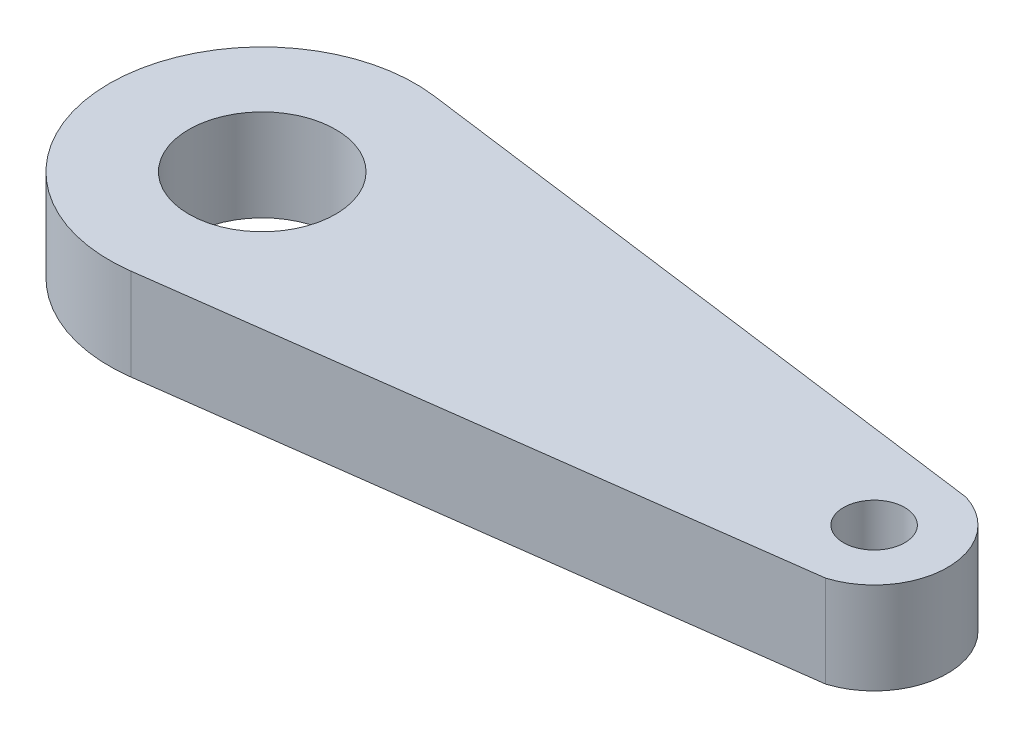
ISO-10303-21;
HEADER;
FILE_DESCRIPTION(('STEP AP214'),'2;1');
FILE_NAME('part.step','',(''),(''),'','','');
FILE_SCHEMA(('AUTOMOTIVE_DESIGN { 1 0 10303 214 1 1 1 1 }'));
ENDSEC;
DATA;
#1=APPLICATION_CONTEXT('core data for automotive mechanical design processes');
#2=APPLICATION_PROTOCOL_DEFINITION('international standard','automotive_design',2000,#1);
#3=PRODUCT_CONTEXT('',#1,'mechanical');
#4=PRODUCT('Part','Part','',(#3));
#5=PRODUCT_RELATED_PRODUCT_CATEGORY('part','',(#4));
#6=PRODUCT_DEFINITION_FORMATION('','',#4);
#7=PRODUCT_DEFINITION_CONTEXT('part definition',#1,'design');
#8=PRODUCT_DEFINITION('design','',#6,#7);
#9=PRODUCT_DEFINITION_SHAPE('','',#8);
#10=(LENGTH_UNIT() NAMED_UNIT(*) SI_UNIT(.MILLI.,.METRE.));
#11=(NAMED_UNIT(*) PLANE_ANGLE_UNIT() SI_UNIT($,.RADIAN.));
#12=(NAMED_UNIT(*) SI_UNIT($,.STERADIAN.) SOLID_ANGLE_UNIT());
#13=UNCERTAINTY_MEASURE_WITH_UNIT(LENGTH_MEASURE(1.E-05),#10,'distance_accuracy_value','');
#14=(GEOMETRIC_REPRESENTATION_CONTEXT(3) GLOBAL_UNCERTAINTY_ASSIGNED_CONTEXT((#13)) GLOBAL_UNIT_ASSIGNED_CONTEXT((#10,
#11,#12)) REPRESENTATION_CONTEXT('',''));
#15=CARTESIAN_POINT('',(0.,0.,0.));
#16=DIRECTION('',(0.,0.,1.));
#17=DIRECTION('',(1.,0.,0.));
#18=AXIS2_PLACEMENT_3D('',#15,#16,#17);
#19=CARTESIAN_POINT('',(31.2759201015185,190.5,235.46813409764));
#20=DIRECTION('',(-0.131668040112529,0.,-0.991293865215016));
#21=DIRECTION('',(-0.991293865215016,0.,0.131668040112529));
#22=AXIS2_PLACEMENT_3D('',#19,#20,#21);
#23=PLANE('',#22);
#24=DIRECTION('',(0.991293865215016,0.,-0.131668040112529));
#25=VECTOR('',#24,1.);
#26=CARTESIAN_POINT('',(31.2759201015185,0.,235.46813409764));
#27=LINE('',#26,#25);
#28=CARTESIAN_POINT('',(-565.509397264272,0.,314.735802205768));
#29=VERTEX_POINT('',#28);
#30=CARTESIAN_POINT('',(707.574831550017,0.,145.639118378526));
#31=VERTEX_POINT('',#30);
#32=EDGE_CURVE('E114',#29,#31,#27,.T.);
#33=ORIENTED_EDGE('',*,*,#32,.T.);
#34=DIRECTION('',(0.,-1.,0.));
#35=VECTOR('',#34,1.);
#36=CARTESIAN_POINT('',(707.574831550017,190.5,145.639118378526));
#37=LINE('',#36,#35);
#38=CARTESIAN_POINT('',(707.574831550017,190.5,145.639118378526));
#39=VERTEX_POINT('',#38);
#40=EDGE_CURVE('E11',#39,#31,#37,.T.);
#41=ORIENTED_EDGE('',*,*,#40,.F.);
#42=DIRECTION('',(0.991293865215016,0.,-0.131668040112529));
#43=VECTOR('',#42,1.);
#44=CARTESIAN_POINT('',(31.2759201015185,190.5,235.46813409764));
#45=LINE('',#44,#43);
#46=CARTESIAN_POINT('',(-565.509397264272,190.5,314.735802205768));
#47=VERTEX_POINT('',#46);
#48=EDGE_CURVE('E93',#47,#39,#45,.T.);
#49=ORIENTED_EDGE('',*,*,#48,.F.);
#50=DIRECTION('',(0.,-1.,0.));
#51=VECTOR('',#50,1.);
#52=CARTESIAN_POINT('',(-565.509397264272,190.5,314.735802205768));
#53=LINE('',#52,#51);
#54=EDGE_CURVE('E101',#47,#29,#53,.T.);
#55=ORIENTED_EDGE('',*,*,#54,.T.);
#56=EDGE_LOOP('',(#33,#41,#49,#55));
#57=FACE_BOUND('',#56,.T.);
#58=ADVANCED_FACE('F44',(#57),#23,.F.);
#59=CARTESIAN_POINT('',(662.686,190.5,0.));
#60=DIRECTION('',(0.,-1.,0.));
#61=DIRECTION('',(0.,0.,-1.));
#62=AXIS2_PLACEMENT_3D('',#59,#60,#61);
#63=CYLINDRICAL_SURFACE('',#62,152.4);
#64=CARTESIAN_POINT('',(662.686,0.,0.));
#65=DIRECTION('',(0.,1.,0.));
#66=DIRECTION('',(0.,0.,1.));
#67=AXIS2_PLACEMENT_3D('',#64,#65,#66);
#68=CIRCLE('',#67,152.4);
#69=CARTESIAN_POINT('',(707.574831550017,0.,-145.639118378526));
#70=VERTEX_POINT('',#69);
#71=EDGE_CURVE('E97',#31,#70,#68,.T.);
#72=ORIENTED_EDGE('',*,*,#71,.T.);
#73=DIRECTION('',(0.,-1.,0.));
#74=VECTOR('',#73,1.);
#75=CARTESIAN_POINT('',(707.574831550017,190.5,-145.639118378526));
#76=LINE('',#75,#74);
#77=CARTESIAN_POINT('',(707.574831550017,190.5,-145.639118378526));
#78=VERTEX_POINT('',#77);
#79=EDGE_CURVE('E53',#78,#70,#76,.T.);
#80=ORIENTED_EDGE('',*,*,#79,.F.);
#81=CARTESIAN_POINT('',(662.686,190.5,0.));
#82=DIRECTION('',(0.,1.,0.));
#83=DIRECTION('',(0.,0.,1.));
#84=AXIS2_PLACEMENT_3D('',#81,#82,#83);
#85=CIRCLE('',#84,152.4);
#86=EDGE_CURVE('E88',#39,#78,#85,.T.);
#87=ORIENTED_EDGE('',*,*,#86,.F.);
#88=ORIENTED_EDGE('',*,*,#40,.T.);
#89=EDGE_LOOP('',(#72,#80,#87,#88));
#90=FACE_BOUND('',#89,.T.);
#91=ADVANCED_FACE('F100',(#90),#63,.T.);
#92=CARTESIAN_POINT('',(31.2759201015185,190.5,-235.46813409764));
#93=DIRECTION('',(0.131668040112529,0.,-0.991293865215016));
#94=DIRECTION('',(-0.991293865215016,0.,-0.131668040112529));
#95=AXIS2_PLACEMENT_3D('',#92,#93,#94);
#96=PLANE('',#95);
#97=DIRECTION('',(0.991293865215016,0.,0.131668040112529));
#98=VECTOR('',#97,1.);
#99=CARTESIAN_POINT('',(31.2759201015185,0.,-235.46813409764));
#100=LINE('',#99,#98);
#101=CARTESIAN_POINT('',(-565.509397264272,0.,-314.735802205768));
#102=VERTEX_POINT('',#101);
#103=EDGE_CURVE('E119',#102,#70,#100,.T.);
#104=ORIENTED_EDGE('',*,*,#103,.F.);
#105=DIRECTION('',(0.,-1.,0.));
#106=VECTOR('',#105,1.);
#107=CARTESIAN_POINT('',(-565.509397264272,190.5,-314.735802205768));
#108=LINE('',#107,#106);
#109=CARTESIAN_POINT('',(-565.509397264272,190.5,-314.735802205768));
#110=VERTEX_POINT('',#109);
#111=EDGE_CURVE('E76',#110,#102,#108,.T.);
#112=ORIENTED_EDGE('',*,*,#111,.F.);
#113=DIRECTION('',(0.991293865215016,0.,0.131668040112529));
#114=VECTOR('',#113,1.);
#115=CARTESIAN_POINT('',(31.2759201015185,190.5,-235.46813409764));
#116=LINE('',#115,#114);
#117=EDGE_CURVE('E91',#110,#78,#116,.T.);
#118=ORIENTED_EDGE('',*,*,#117,.T.);
#119=ORIENTED_EDGE('',*,*,#79,.T.);
#120=EDGE_LOOP('',(#104,#112,#118,#119));
#121=FACE_BOUND('',#120,.T.);
#122=ADVANCED_FACE('F105',(#121),#96,.T.);
#123=CARTESIAN_POINT('',(-607.314,190.5,0.));
#124=DIRECTION('',(0.,-1.,0.));
#125=DIRECTION('',(0.,0.,-1.));
#126=AXIS2_PLACEMENT_3D('',#123,#124,#125);
#127=CYLINDRICAL_SURFACE('',#126,152.4);
#128=CARTESIAN_POINT('',(-607.314,190.5,0.));
#129=DIRECTION('',(0.,1.,0.));
#130=DIRECTION('',(0.,0.,1.));
#131=AXIS2_PLACEMENT_3D('',#128,#129,#130);
#132=CIRCLE('',#131,152.4);
#133=CARTESIAN_POINT('',(-607.314,190.5,152.4));
#134=VERTEX_POINT('',#133);
#135=EDGE_CURVE('E157',#134,#134,#132,.T.);
#136=ORIENTED_EDGE('',*,*,#135,.T.);
#137=EDGE_LOOP('',(#136));
#138=FACE_BOUND('',#137,.T.);
#139=CARTESIAN_POINT('',(-607.314,0.,0.));
#140=DIRECTION('',(0.,1.,0.));
#141=DIRECTION('',(0.,0.,1.));
#142=AXIS2_PLACEMENT_3D('',#139,#140,#141);
#143=CIRCLE('',#142,152.4);
#144=CARTESIAN_POINT('',(-607.314,0.,152.4));
#145=VERTEX_POINT('',#144);
#146=EDGE_CURVE('E112',#145,#145,#143,.T.);
#147=ORIENTED_EDGE('',*,*,#146,.F.);
#148=EDGE_LOOP('',(#147));
#149=FACE_BOUND('',#148,.T.);
#150=ADVANCED_FACE('F144',(#138,#149),#127,.F.);
#151=CARTESIAN_POINT('',(662.686,190.5,0.));
#152=DIRECTION('',(0.,-1.,0.));
#153=DIRECTION('',(0.,0.,-1.));
#154=AXIS2_PLACEMENT_3D('',#151,#152,#153);
#155=CYLINDRICAL_SURFACE('',#154,63.5);
#156=CARTESIAN_POINT('',(662.686,190.5,0.));
#157=DIRECTION('',(0.,1.,0.));
#158=DIRECTION('',(0.,0.,1.));
#159=AXIS2_PLACEMENT_3D('',#156,#157,#158);
#160=CIRCLE('',#159,63.5);
#161=CARTESIAN_POINT('',(662.686,190.5,63.5));
#162=VERTEX_POINT('',#161);
#163=EDGE_CURVE('E123',#162,#162,#160,.T.);
#164=ORIENTED_EDGE('',*,*,#163,.T.);
#165=EDGE_LOOP('',(#164));
#166=FACE_BOUND('',#165,.T.);
#167=CARTESIAN_POINT('',(662.686,0.,0.));
#168=DIRECTION('',(0.,1.,0.));
#169=DIRECTION('',(0.,0.,1.));
#170=AXIS2_PLACEMENT_3D('',#167,#168,#169);
#171=CIRCLE('',#170,63.5);
#172=CARTESIAN_POINT('',(662.686,0.,63.5));
#173=VERTEX_POINT('',#172);
#174=EDGE_CURVE('E109',#173,#173,#171,.T.);
#175=ORIENTED_EDGE('',*,*,#174,.F.);
#176=EDGE_LOOP('',(#175));
#177=FACE_BOUND('',#176,.T.);
#178=ADVANCED_FACE('F50',(#166,#177),#155,.F.);
#179=CARTESIAN_POINT('',(-607.314,190.5,0.));
#180=DIRECTION('',(0.,-1.,0.));
#181=DIRECTION('',(0.,0.,-1.));
#182=AXIS2_PLACEMENT_3D('',#179,#180,#181);
#183=CYLINDRICAL_SURFACE('',#182,317.5);
#184=CARTESIAN_POINT('',(-607.314,0.,0.));
#185=DIRECTION('',(0.,1.,0.));
#186=DIRECTION('',(0.,0.,1.));
#187=AXIS2_PLACEMENT_3D('',#184,#185,#186);
#188=CIRCLE('',#187,317.5);
#189=EDGE_CURVE('E83',#102,#29,#188,.T.);
#190=ORIENTED_EDGE('',*,*,#189,.T.);
#191=ORIENTED_EDGE('',*,*,#54,.F.);
#192=CARTESIAN_POINT('',(-607.314,190.5,0.));
#193=DIRECTION('',(0.,1.,0.));
#194=DIRECTION('',(0.,0.,1.));
#195=AXIS2_PLACEMENT_3D('',#192,#193,#194);
#196=CIRCLE('',#195,317.5);
#197=EDGE_CURVE('E62',#110,#47,#196,.T.);
#198=ORIENTED_EDGE('',*,*,#197,.F.);
#199=ORIENTED_EDGE('',*,*,#111,.T.);
#200=EDGE_LOOP('',(#190,#191,#198,#199));
#201=FACE_BOUND('',#200,.T.);
#202=ADVANCED_FACE('F133',(#201),#183,.T.);
#203=CARTESIAN_POINT('',(0.,190.5,0.));
#204=DIRECTION('',(0.,1.,0.));
#205=DIRECTION('',(0.,0.,1.));
#206=AXIS2_PLACEMENT_3D('',#203,#204,#205);
#207=PLANE('',#206);
#208=ORIENTED_EDGE('',*,*,#163,.F.);
#209=EDGE_LOOP('',(#208));
#210=FACE_BOUND('',#209,.T.);
#211=ORIENTED_EDGE('',*,*,#135,.F.);
#212=EDGE_LOOP('',(#211));
#213=FACE_BOUND('',#212,.T.);
#214=ORIENTED_EDGE('',*,*,#48,.T.);
#215=ORIENTED_EDGE('',*,*,#86,.T.);
#216=ORIENTED_EDGE('',*,*,#117,.F.);
#217=ORIENTED_EDGE('',*,*,#197,.T.);
#218=EDGE_LOOP('',(#214,#215,#216,#217));
#219=FACE_BOUND('',#218,.T.);
#220=ADVANCED_FACE('F87',(#210,#213,#219),#207,.T.);
#221=CARTESIAN_POINT('',(0.,0.,0.));
#222=DIRECTION('',(0.,1.,0.));
#223=DIRECTION('',(0.,0.,1.));
#224=AXIS2_PLACEMENT_3D('',#221,#222,#223);
#225=PLANE('',#224);
#226=ORIENTED_EDGE('',*,*,#174,.T.);
#227=EDGE_LOOP('',(#226));
#228=FACE_BOUND('',#227,.T.);
#229=ORIENTED_EDGE('',*,*,#146,.T.);
#230=EDGE_LOOP('',(#229));
#231=FACE_BOUND('',#230,.T.);
#232=ORIENTED_EDGE('',*,*,#32,.F.);
#233=ORIENTED_EDGE('',*,*,#189,.F.);
#234=ORIENTED_EDGE('',*,*,#103,.T.);
#235=ORIENTED_EDGE('',*,*,#71,.F.);
#236=EDGE_LOOP('',(#232,#233,#234,#235));
#237=FACE_BOUND('',#236,.T.);
#238=ADVANCED_FACE('F128',(#228,#231,#237),#225,.F.);
#239=CLOSED_SHELL('',(#58,#91,#122,#150,#178,#202,#220,#238));
#240=MANIFOLD_SOLID_BREP('B2',#239);
#241=ADVANCED_BREP_SHAPE_REPRESENTATION('',(#18,#240),#14);
#242=SHAPE_DEFINITION_REPRESENTATION(#9,#241);
ENDSEC;
END-ISO-10303-21;
